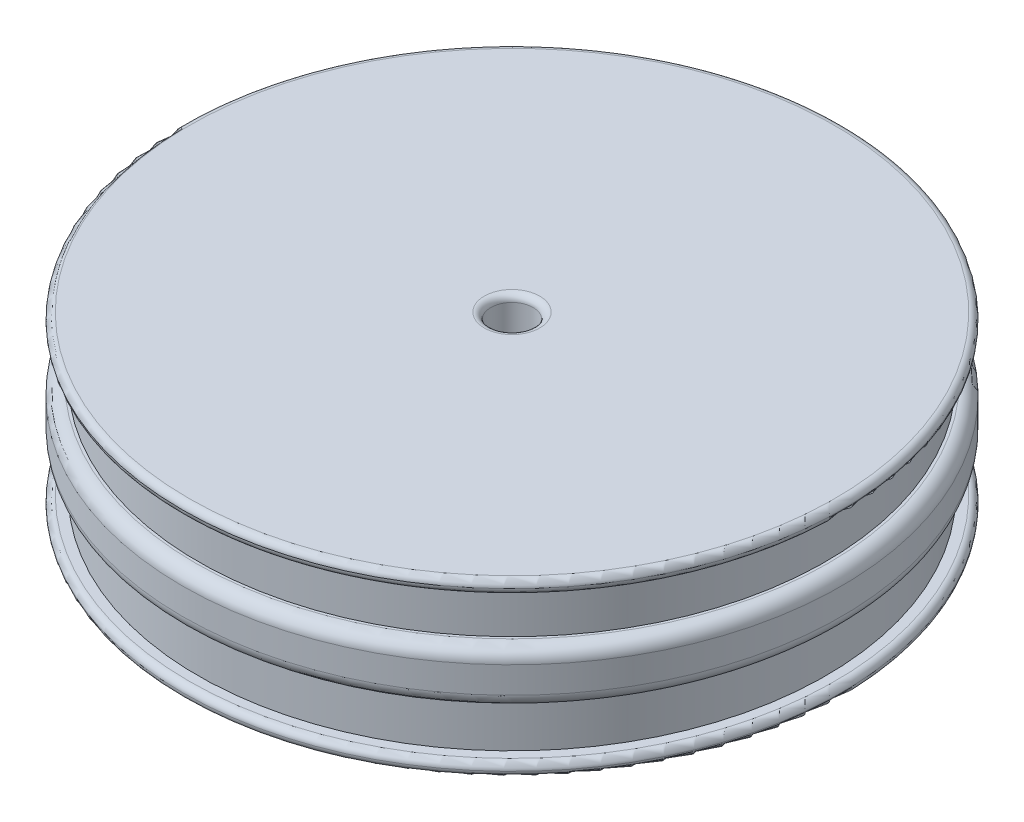
ISO-10303-21;
HEADER;
FILE_DESCRIPTION(('STEP AP214'),'2;1');
FILE_NAME('part.step','',(''),(''),'','','');
FILE_SCHEMA(('AUTOMOTIVE_DESIGN { 1 0 10303 214 1 1 1 1 }'));
ENDSEC;
DATA;
#1=APPLICATION_CONTEXT('core data for automotive mechanical design processes');
#2=APPLICATION_PROTOCOL_DEFINITION('international standard','automotive_design',2000,#1);
#3=PRODUCT_CONTEXT('',#1,'mechanical');
#4=PRODUCT('Part','Part','',(#3));
#5=PRODUCT_RELATED_PRODUCT_CATEGORY('part','',(#4));
#6=PRODUCT_DEFINITION_FORMATION('','',#4);
#7=PRODUCT_DEFINITION_CONTEXT('part definition',#1,'design');
#8=PRODUCT_DEFINITION('design','',#6,#7);
#9=PRODUCT_DEFINITION_SHAPE('','',#8);
#10=(LENGTH_UNIT() NAMED_UNIT(*) SI_UNIT(.MILLI.,.METRE.));
#11=(NAMED_UNIT(*) PLANE_ANGLE_UNIT() SI_UNIT($,.RADIAN.));
#12=(NAMED_UNIT(*) SI_UNIT($,.STERADIAN.) SOLID_ANGLE_UNIT());
#13=UNCERTAINTY_MEASURE_WITH_UNIT(LENGTH_MEASURE(1.E-05),#10,'distance_accuracy_value','');
#14=(GEOMETRIC_REPRESENTATION_CONTEXT(3) GLOBAL_UNCERTAINTY_ASSIGNED_CONTEXT((#13)) GLOBAL_UNIT_ASSIGNED_CONTEXT((#10,
#11,#12)) REPRESENTATION_CONTEXT('',''));
#15=CARTESIAN_POINT('',(0.,0.,0.));
#16=DIRECTION('',(0.,0.,1.));
#17=DIRECTION('',(1.,0.,0.));
#18=AXIS2_PLACEMENT_3D('',#15,#16,#17);
#19=CARTESIAN_POINT('',(0.,13.,0.));
#20=DIRECTION('',(0.,1.,0.));
#21=DIRECTION('',(0.,0.,1.));
#22=AXIS2_PLACEMENT_3D('',#19,#20,#21);
#23=PLANE('',#22);
#24=CARTESIAN_POINT('',(0.,13.,0.));
#25=DIRECTION('',(0.,1.,0.));
#26=DIRECTION('',(0.,0.,1.));
#27=AXIS2_PLACEMENT_3D('',#24,#25,#26);
#28=CIRCLE('',#27,2.1);
#29=CARTESIAN_POINT('',(0.,13.,2.1));
#30=VERTEX_POINT('',#29);
#31=EDGE_CURVE('E10',#30,#30,#28,.F.);
#32=ORIENTED_EDGE('',*,*,#31,.T.);
#33=EDGE_LOOP('',(#32));
#34=FACE_BOUND('',#33,.T.);
#35=CARTESIAN_POINT('',(0.,13.,0.));
#36=DIRECTION('',(0.,1.,0.));
#37=DIRECTION('',(0.,0.,1.));
#38=AXIS2_PLACEMENT_3D('',#35,#36,#37);
#39=CIRCLE('',#38,24.5);
#40=CARTESIAN_POINT('',(0.,13.,24.5));
#41=VERTEX_POINT('',#40);
#42=EDGE_CURVE('E65',#41,#41,#39,.T.);
#43=ORIENTED_EDGE('',*,*,#42,.T.);
#44=EDGE_LOOP('',(#43));
#45=FACE_BOUND('',#44,.T.);
#46=ADVANCED_FACE('F41',(#34,#45),#23,.T.);
#47=CARTESIAN_POINT('',(0.,0.,0.));
#48=DIRECTION('',(0.,1.,0.));
#49=DIRECTION('',(0.,0.,1.));
#50=AXIS2_PLACEMENT_3D('',#47,#48,#49);
#51=PLANE('',#50);
#52=CARTESIAN_POINT('',(0.,0.,0.));
#53=DIRECTION('',(0.,1.,0.));
#54=DIRECTION('',(0.,0.,1.));
#55=AXIS2_PLACEMENT_3D('',#52,#53,#54);
#56=CIRCLE('',#55,2.1);
#57=CARTESIAN_POINT('',(0.,0.,2.1));
#58=VERTEX_POINT('',#57);
#59=EDGE_CURVE('E59',#58,#58,#56,.T.);
#60=ORIENTED_EDGE('',*,*,#59,.T.);
#61=EDGE_LOOP('',(#60));
#62=FACE_BOUND('',#61,.T.);
#63=CARTESIAN_POINT('',(0.,0.,0.));
#64=DIRECTION('',(0.,1.,0.));
#65=DIRECTION('',(0.,0.,1.));
#66=AXIS2_PLACEMENT_3D('',#63,#64,#65);
#67=CIRCLE('',#66,24.5);
#68=CARTESIAN_POINT('',(0.,0.,24.5));
#69=VERTEX_POINT('',#68);
#70=EDGE_CURVE('E69',#69,#69,#67,.F.);
#71=ORIENTED_EDGE('',*,*,#70,.T.);
#72=EDGE_LOOP('',(#71));
#73=FACE_BOUND('',#72,.T.);
#74=ADVANCED_FACE('F140',(#62,#73),#51,.F.);
#75=CARTESIAN_POINT('',(0.,13.,0.));
#76=DIRECTION('',(0.,-1.,0.));
#77=DIRECTION('',(0.,0.,-1.));
#78=AXIS2_PLACEMENT_3D('',#75,#76,#77);
#79=CYLINDRICAL_SURFACE('',#78,1.6);
#80=CARTESIAN_POINT('',(0.,0.500000000000002,0.));
#81=DIRECTION('',(0.,1.,0.));
#82=DIRECTION('',(0.,0.,1.));
#83=AXIS2_PLACEMENT_3D('',#80,#81,#82);
#84=CIRCLE('',#83,1.6);
#85=CARTESIAN_POINT('',(0.,0.5,-1.6));
#86=VERTEX_POINT('',#85);
#87=EDGE_CURVE('E49',#86,#86,#84,.F.);
#88=CARTESIAN_POINT('',(0.,12.5,0.));
#89=DIRECTION('',(0.,1.,0.));
#90=DIRECTION('',(0.,0.,1.));
#91=AXIS2_PLACEMENT_3D('',#88,#89,#90);
#92=CIRCLE('',#91,1.6);
#93=CARTESIAN_POINT('',(0.,12.5,-1.6));
#94=VERTEX_POINT('',#93);
#95=EDGE_CURVE('E54',#94,#94,#92,.T.);
#96=CARTESIAN_POINT('',(0.,0.5,-1.6));
#97=CARTESIAN_POINT('',(0.,0.625000000000001,-1.6));
#98=CARTESIAN_POINT('',(0.,0.750000000000001,-1.6));
#99=CARTESIAN_POINT('',(0.,1.,-1.6));
#100=CARTESIAN_POINT('',(0.,1.125,-1.6));
#101=CARTESIAN_POINT('',(0.,1.375,-1.6));
#102=CARTESIAN_POINT('',(0.,1.5,-1.6));
#103=CARTESIAN_POINT('',(0.,1.75,-1.6));
#104=CARTESIAN_POINT('',(0.,1.875,-1.6));
#105=CARTESIAN_POINT('',(0.,2.125,-1.6));
#106=CARTESIAN_POINT('',(0.,2.25,-1.6));
#107=CARTESIAN_POINT('',(0.,2.5,-1.6));
#108=CARTESIAN_POINT('',(0.,2.625,-1.6));
#109=CARTESIAN_POINT('',(0.,2.875,-1.6));
#110=CARTESIAN_POINT('',(0.,3.,-1.6));
#111=CARTESIAN_POINT('',(0.,3.25,-1.6));
#112=CARTESIAN_POINT('',(0.,3.375,-1.6));
#113=CARTESIAN_POINT('',(0.,3.625,-1.6));
#114=CARTESIAN_POINT('',(0.,3.75,-1.6));
#115=CARTESIAN_POINT('',(0.,4.,-1.6));
#116=CARTESIAN_POINT('',(0.,4.125,-1.6));
#117=CARTESIAN_POINT('',(0.,4.375,-1.6));
#118=CARTESIAN_POINT('',(0.,4.5,-1.6));
#119=CARTESIAN_POINT('',(0.,4.75,-1.6));
#120=CARTESIAN_POINT('',(0.,4.875,-1.6));
#121=CARTESIAN_POINT('',(0.,5.125,-1.6));
#122=CARTESIAN_POINT('',(0.,5.25,-1.6));
#123=CARTESIAN_POINT('',(0.,5.5,-1.6));
#124=CARTESIAN_POINT('',(0.,5.625,-1.6));
#125=CARTESIAN_POINT('',(0.,5.875,-1.6));
#126=CARTESIAN_POINT('',(0.,6.,-1.6));
#127=CARTESIAN_POINT('',(0.,6.25,-1.6));
#128=CARTESIAN_POINT('',(0.,6.375,-1.6));
#129=CARTESIAN_POINT('',(0.,6.625,-1.6));
#130=CARTESIAN_POINT('',(0.,6.75,-1.6));
#131=CARTESIAN_POINT('',(0.,7.,-1.6));
#132=CARTESIAN_POINT('',(0.,7.125,-1.6));
#133=CARTESIAN_POINT('',(0.,7.375,-1.6));
#134=CARTESIAN_POINT('',(0.,7.5,-1.6));
#135=CARTESIAN_POINT('',(0.,7.75,-1.6));
#136=CARTESIAN_POINT('',(0.,7.875,-1.6));
#137=CARTESIAN_POINT('',(0.,8.125,-1.6));
#138=CARTESIAN_POINT('',(0.,8.25,-1.6));
#139=CARTESIAN_POINT('',(0.,8.5,-1.6));
#140=CARTESIAN_POINT('',(0.,8.625,-1.6));
#141=CARTESIAN_POINT('',(0.,8.875,-1.6));
#142=CARTESIAN_POINT('',(0.,9.,-1.6));
#143=CARTESIAN_POINT('',(0.,9.25,-1.6));
#144=CARTESIAN_POINT('',(0.,9.375,-1.6));
#145=CARTESIAN_POINT('',(0.,9.625,-1.6));
#146=CARTESIAN_POINT('',(0.,9.75,-1.6));
#147=CARTESIAN_POINT('',(0.,10.,-1.6));
#148=CARTESIAN_POINT('',(0.,10.125,-1.6));
#149=CARTESIAN_POINT('',(0.,10.375,-1.6));
#150=CARTESIAN_POINT('',(0.,10.5,-1.6));
#151=CARTESIAN_POINT('',(0.,10.75,-1.6));
#152=CARTESIAN_POINT('',(0.,10.875,-1.6));
#153=CARTESIAN_POINT('',(0.,11.125,-1.6));
#154=CARTESIAN_POINT('',(0.,11.25,-1.6));
#155=CARTESIAN_POINT('',(0.,11.5,-1.6));
#156=CARTESIAN_POINT('',(0.,11.625,-1.6));
#157=CARTESIAN_POINT('',(0.,11.875,-1.6));
#158=CARTESIAN_POINT('',(0.,12.,-1.6));
#159=CARTESIAN_POINT('',(0.,12.25,-1.6));
#160=CARTESIAN_POINT('',(0.,12.375,-1.6));
#161=CARTESIAN_POINT('',(0.,12.5,-1.6));
#162=B_SPLINE_CURVE_WITH_KNOTS('',3,(#96,#97,#98,#99,#100,#101,#102,#103,#104,#105,#106,#107,
#108,#109,#110,#111,#112,#113,#114,#115,#116,#117,#118,#119,#120,#121,#122,#123,#124,#125,#126,
#127,#128,#129,#130,#131,#132,#133,#134,#135,#136,#137,#138,#139,#140,#141,#142,#143,#144,#145,
#146,#147,#148,#149,#150,#151,#152,#153,#154,#155,#156,#157,#158,#159,#160,#161),.UNSPECIFIED.,
.F.,.F.,(4,2,2,2,2,2,2,2,2,2,2,2,2,2,2,2,2,2,2,2,2,2,2,2,2,2,2,2,2,2,2,2,4),(0.,0.375,
0.750000000000001,1.125,1.5,1.875,2.25,2.625,3.,3.375,3.75,4.125,4.5,4.875,5.25,5.625,6.,6.375,
6.75,7.125,7.5,7.875,8.25,8.625,9.,9.375,9.75,10.125,10.5,10.875,11.25,11.625,12.),.UNSPECIFIED.);
#163=EDGE_CURVE('BSEAM145',#86,#94,#162,.T.);
#164=ORIENTED_EDGE('',*,*,#87,.T.);
#165=ORIENTED_EDGE('',*,*,#95,.T.);
#166=ORIENTED_EDGE('',*,*,#163,.T.);
#167=ORIENTED_EDGE('',*,*,#163,.F.);
#168=EDGE_LOOP('',(#164,#166,#165,#167));
#169=FACE_BOUND('',#168,.T.);
#170=ADVANCED_FACE('F145',(#169),#79,.F.);
#171=CARTESIAN_POINT('',(0.,1.,25.));
#172=DIRECTION('',(0.,1.,0.));
#173=DIRECTION('',(0.,0.,1.));
#174=AXIS2_PLACEMENT_3D('',#171,#172,#173);
#175=PLANE('',#174);
#176=CARTESIAN_POINT('',(0.,1.,0.));
#177=DIRECTION('',(0.,1.,0.));
#178=DIRECTION('',(0.,0.,1.));
#179=AXIS2_PLACEMENT_3D('',#176,#177,#178);
#180=CIRCLE('',#179,24.5);
#181=CARTESIAN_POINT('',(0.,1.,24.5));
#182=VERTEX_POINT('',#181);
#183=EDGE_CURVE('E73',#182,#182,#180,.T.);
#184=ORIENTED_EDGE('',*,*,#183,.T.);
#185=EDGE_LOOP('',(#184));
#186=FACE_BOUND('',#185,.T.);
#187=CARTESIAN_POINT('',(0.,1.,0.));
#188=DIRECTION('',(0.,-1.,0.));
#189=DIRECTION('',(0.,0.,-1.));
#190=AXIS2_PLACEMENT_3D('',#187,#188,#189);
#191=CIRCLE('',#190,23.8);
#192=CARTESIAN_POINT('',(0.,1.,-23.8));
#193=VERTEX_POINT('',#192);
#194=EDGE_CURVE('E106',#193,#193,#191,.T.);
#195=ORIENTED_EDGE('',*,*,#194,.T.);
#196=EDGE_LOOP('',(#195));
#197=FACE_BOUND('',#196,.T.);
#198=ADVANCED_FACE('F194',(#186,#197),#175,.T.);
#199=CARTESIAN_POINT('',(0.,-0.543449180327872,0.));
#200=DIRECTION('',(0.,-1.,0.));
#201=DIRECTION('',(0.,0.,-1.));
#202=AXIS2_PLACEMENT_3D('',#199,#200,#201);
#203=CYLINDRICAL_SURFACE('',#202,23.8);
#204=CARTESIAN_POINT('',(0.,4.5,0.));
#205=DIRECTION('',(0.,-1.,0.));
#206=DIRECTION('',(0.,0.,-1.));
#207=AXIS2_PLACEMENT_3D('',#204,#205,#206);
#208=CIRCLE('',#207,23.8);
#209=CARTESIAN_POINT('',(0.,4.5,-23.8));
#210=VERTEX_POINT('',#209);
#211=EDGE_CURVE('E111',#210,#210,#208,.T.);
#212=ORIENTED_EDGE('',*,*,#211,.T.);
#213=EDGE_LOOP('',(#212));
#214=FACE_BOUND('',#213,.T.);
#215=ORIENTED_EDGE('',*,*,#194,.F.);
#216=EDGE_LOOP('',(#215));
#217=FACE_BOUND('',#216,.T.);
#218=ADVANCED_FACE('F198',(#214,#217),#203,.T.);
#219=CARTESIAN_POINT('',(0.,4.5,25.));
#220=DIRECTION('',(0.,-1.,0.));
#221=DIRECTION('',(0.,0.,-1.));
#222=AXIS2_PLACEMENT_3D('',#219,#220,#221);
#223=PLANE('',#222);
#224=CARTESIAN_POINT('',(0.,4.5,0.));
#225=DIRECTION('',(0.,-1.,0.));
#226=DIRECTION('',(0.,0.,-1.));
#227=AXIS2_PLACEMENT_3D('',#224,#225,#226);
#228=CIRCLE('',#227,24.);
#229=CARTESIAN_POINT('',(0.,4.5,-24.));
#230=VERTEX_POINT('',#229);
#231=EDGE_CURVE('E101',#230,#230,#228,.T.);
#232=ORIENTED_EDGE('',*,*,#231,.T.);
#233=EDGE_LOOP('',(#232));
#234=FACE_BOUND('',#233,.T.);
#235=ORIENTED_EDGE('',*,*,#211,.F.);
#236=EDGE_LOOP('',(#235));
#237=FACE_BOUND('',#236,.T.);
#238=ADVANCED_FACE('F203',(#234,#237),#223,.T.);
#239=CARTESIAN_POINT('',(0.,8.5,25.));
#240=DIRECTION('',(0.,1.,0.));
#241=DIRECTION('',(0.,0.,1.));
#242=AXIS2_PLACEMENT_3D('',#239,#240,#241);
#243=PLANE('',#242);
#244=CARTESIAN_POINT('',(0.,8.5,0.));
#245=DIRECTION('',(0.,1.,0.));
#246=DIRECTION('',(0.,0.,1.));
#247=AXIS2_PLACEMENT_3D('',#244,#245,#246);
#248=CIRCLE('',#247,24.);
#249=CARTESIAN_POINT('',(0.,8.5,24.));
#250=VERTEX_POINT('',#249);
#251=EDGE_CURVE('E89',#250,#250,#248,.T.);
#252=ORIENTED_EDGE('',*,*,#251,.T.);
#253=EDGE_LOOP('',(#252));
#254=FACE_BOUND('',#253,.T.);
#255=CARTESIAN_POINT('',(0.,8.5,0.));
#256=DIRECTION('',(0.,-1.,0.));
#257=DIRECTION('',(0.,0.,-1.));
#258=AXIS2_PLACEMENT_3D('',#255,#256,#257);
#259=CIRCLE('',#258,23.8);
#260=CARTESIAN_POINT('',(0.,8.5,-23.8));
#261=VERTEX_POINT('',#260);
#262=EDGE_CURVE('E105',#261,#261,#259,.T.);
#263=ORIENTED_EDGE('',*,*,#262,.T.);
#264=EDGE_LOOP('',(#263));
#265=FACE_BOUND('',#264,.T.);
#266=ADVANCED_FACE('F137',(#254,#265),#243,.T.);
#267=CARTESIAN_POINT('',(0.,-0.543449180327872,0.));
#268=DIRECTION('',(0.,-1.,0.));
#269=DIRECTION('',(0.,0.,-1.));
#270=AXIS2_PLACEMENT_3D('',#267,#268,#269);
#271=CYLINDRICAL_SURFACE('',#270,23.8);
#272=CARTESIAN_POINT('',(0.,12.,0.));
#273=DIRECTION('',(0.,-1.,0.));
#274=DIRECTION('',(0.,0.,-1.));
#275=AXIS2_PLACEMENT_3D('',#272,#273,#274);
#276=CIRCLE('',#275,23.8);
#277=CARTESIAN_POINT('',(0.,12.,-23.8));
#278=VERTEX_POINT('',#277);
#279=EDGE_CURVE('E110',#278,#278,#276,.T.);
#280=ORIENTED_EDGE('',*,*,#279,.T.);
#281=EDGE_LOOP('',(#280));
#282=FACE_BOUND('',#281,.T.);
#283=ORIENTED_EDGE('',*,*,#262,.F.);
#284=EDGE_LOOP('',(#283));
#285=FACE_BOUND('',#284,.T.);
#286=ADVANCED_FACE('F122',(#282,#285),#271,.T.);
#287=CARTESIAN_POINT('',(0.,12.,25.));
#288=DIRECTION('',(0.,-1.,0.));
#289=DIRECTION('',(0.,0.,-1.));
#290=AXIS2_PLACEMENT_3D('',#287,#288,#289);
#291=PLANE('',#290);
#292=CARTESIAN_POINT('',(0.,12.,0.));
#293=DIRECTION('',(0.,-1.,0.));
#294=DIRECTION('',(0.,0.,-1.));
#295=AXIS2_PLACEMENT_3D('',#292,#293,#294);
#296=CIRCLE('',#295,24.5);
#297=CARTESIAN_POINT('',(0.,12.,-24.5));
#298=VERTEX_POINT('',#297);
#299=EDGE_CURVE('E85',#298,#298,#296,.T.);
#300=ORIENTED_EDGE('',*,*,#299,.T.);
#301=EDGE_LOOP('',(#300));
#302=FACE_BOUND('',#301,.T.);
#303=ORIENTED_EDGE('',*,*,#279,.F.);
#304=EDGE_LOOP('',(#303));
#305=FACE_BOUND('',#304,.T.);
#306=ADVANCED_FACE('F125',(#302,#305),#291,.T.);
#307=CARTESIAN_POINT('',(0.,13.,0.));
#308=DIRECTION('',(0.,-1.,0.));
#309=DIRECTION('',(0.,0.,-1.));
#310=AXIS2_PLACEMENT_3D('',#307,#308,#309);
#311=CYLINDRICAL_SURFACE('',#310,25.);
#312=CARTESIAN_POINT('',(0.,5.5,0.));
#313=DIRECTION('',(0.,-1.,0.));
#314=DIRECTION('',(0.,0.,-1.));
#315=AXIS2_PLACEMENT_3D('',#312,#313,#314);
#316=CIRCLE('',#315,25.);
#317=CARTESIAN_POINT('',(0.,5.5,-25.));
#318=VERTEX_POINT('',#317);
#319=EDGE_CURVE('E93',#318,#318,#316,.F.);
#320=CARTESIAN_POINT('',(0.,7.5,0.));
#321=DIRECTION('',(0.,1.,0.));
#322=DIRECTION('',(0.,0.,1.));
#323=AXIS2_PLACEMENT_3D('',#320,#321,#322);
#324=CIRCLE('',#323,25.);
#325=CARTESIAN_POINT('',(0.,7.5,-25.));
#326=VERTEX_POINT('',#325);
#327=EDGE_CURVE('E97',#326,#326,#324,.F.);
#328=CARTESIAN_POINT('',(0.,5.5,-25.));
#329=CARTESIAN_POINT('',(0.,5.52083333333333,-25.));
#330=CARTESIAN_POINT('',(0.,5.54166666666667,-25.));
#331=CARTESIAN_POINT('',(0.,5.58333333333333,-25.));
#332=CARTESIAN_POINT('',(0.,5.60416666666667,-25.));
#333=CARTESIAN_POINT('',(0.,5.64583333333333,-25.));
#334=CARTESIAN_POINT('',(0.,5.66666666666667,-25.));
#335=CARTESIAN_POINT('',(0.,5.70833333333333,-25.));
#336=CARTESIAN_POINT('',(0.,5.72916666666667,-25.));
#337=CARTESIAN_POINT('',(0.,5.77083333333333,-25.));
#338=CARTESIAN_POINT('',(0.,5.79166666666667,-25.));
#339=CARTESIAN_POINT('',(0.,5.83333333333333,-25.));
#340=CARTESIAN_POINT('',(0.,5.85416666666667,-25.));
#341=CARTESIAN_POINT('',(0.,5.89583333333333,-25.));
#342=CARTESIAN_POINT('',(0.,5.91666666666667,-25.));
#343=CARTESIAN_POINT('',(0.,5.95833333333333,-25.));
#344=CARTESIAN_POINT('',(0.,5.97916666666667,-25.));
#345=CARTESIAN_POINT('',(0.,6.02083333333333,-25.));
#346=CARTESIAN_POINT('',(0.,6.04166666666667,-25.));
#347=CARTESIAN_POINT('',(0.,6.08333333333333,-25.));
#348=CARTESIAN_POINT('',(0.,6.10416666666667,-25.));
#349=CARTESIAN_POINT('',(0.,6.14583333333333,-25.));
#350=CARTESIAN_POINT('',(0.,6.16666666666667,-25.));
#351=CARTESIAN_POINT('',(0.,6.20833333333333,-25.));
#352=CARTESIAN_POINT('',(0.,6.22916666666667,-25.));
#353=CARTESIAN_POINT('',(0.,6.27083333333333,-25.));
#354=CARTESIAN_POINT('',(0.,6.29166666666667,-25.));
#355=CARTESIAN_POINT('',(0.,6.33333333333333,-25.));
#356=CARTESIAN_POINT('',(0.,6.35416666666667,-25.));
#357=CARTESIAN_POINT('',(0.,6.39583333333333,-25.));
#358=CARTESIAN_POINT('',(0.,6.41666666666667,-25.));
#359=CARTESIAN_POINT('',(0.,6.45833333333333,-25.));
#360=CARTESIAN_POINT('',(0.,6.47916666666667,-25.));
#361=CARTESIAN_POINT('',(0.,6.52083333333333,-25.));
#362=CARTESIAN_POINT('',(0.,6.54166666666667,-25.));
#363=CARTESIAN_POINT('',(0.,6.58333333333333,-25.));
#364=CARTESIAN_POINT('',(0.,6.60416666666667,-25.));
#365=CARTESIAN_POINT('',(0.,6.64583333333333,-25.));
#366=CARTESIAN_POINT('',(0.,6.66666666666667,-25.));
#367=CARTESIAN_POINT('',(0.,6.70833333333333,-25.));
#368=CARTESIAN_POINT('',(0.,6.72916666666667,-25.));
#369=CARTESIAN_POINT('',(0.,6.77083333333333,-25.));
#370=CARTESIAN_POINT('',(0.,6.79166666666667,-25.));
#371=CARTESIAN_POINT('',(0.,6.83333333333333,-25.));
#372=CARTESIAN_POINT('',(0.,6.85416666666667,-25.));
#373=CARTESIAN_POINT('',(0.,6.89583333333333,-25.));
#374=CARTESIAN_POINT('',(0.,6.91666666666667,-25.));
#375=CARTESIAN_POINT('',(0.,6.95833333333333,-25.));
#376=CARTESIAN_POINT('',(0.,6.97916666666667,-25.));
#377=CARTESIAN_POINT('',(0.,7.02083333333333,-25.));
#378=CARTESIAN_POINT('',(0.,7.04166666666667,-25.));
#379=CARTESIAN_POINT('',(0.,7.08333333333333,-25.));
#380=CARTESIAN_POINT('',(0.,7.10416666666667,-25.));
#381=CARTESIAN_POINT('',(0.,7.14583333333333,-25.));
#382=CARTESIAN_POINT('',(0.,7.16666666666667,-25.));
#383=CARTESIAN_POINT('',(0.,7.20833333333333,-25.));
#384=CARTESIAN_POINT('',(0.,7.22916666666667,-25.));
#385=CARTESIAN_POINT('',(0.,7.27083333333333,-25.));
#386=CARTESIAN_POINT('',(0.,7.29166666666667,-25.));
#387=CARTESIAN_POINT('',(0.,7.33333333333333,-25.));
#388=CARTESIAN_POINT('',(0.,7.35416666666667,-25.));
#389=CARTESIAN_POINT('',(0.,7.39583333333333,-25.));
#390=CARTESIAN_POINT('',(0.,7.41666666666667,-25.));
#391=CARTESIAN_POINT('',(0.,7.45833333333333,-25.));
#392=CARTESIAN_POINT('',(0.,7.47916666666667,-25.));
#393=CARTESIAN_POINT('',(0.,7.5,-25.));
#394=B_SPLINE_CURVE_WITH_KNOTS('',3,(#328,#329,#330,#331,#332,#333,#334,#335,#336,#337,#338,
#339,#340,#341,#342,#343,#344,#345,#346,#347,#348,#349,#350,#351,#352,#353,#354,#355,#356,#357,
#358,#359,#360,#361,#362,#363,#364,#365,#366,#367,#368,#369,#370,#371,#372,#373,#374,#375,#376,
#377,#378,#379,#380,#381,#382,#383,#384,#385,#386,#387,#388,#389,#390,#391,#392,#393),
.UNSPECIFIED.,.F.,.F.,(4,2,2,2,2,2,2,2,2,2,2,2,2,2,2,2,2,2,2,2,2,2,2,2,2,2,2,2,2,2,2,2,4),(0.,
0.0625000000000001,0.125,0.1875,0.25,0.3125,0.375,0.4375,0.5,0.5625,0.625,0.6875,0.75,0.8125,
0.875,0.9375,1.,1.0625,1.125,1.1875,1.25,1.3125,1.375,1.4375,1.5,1.5625,1.625,1.6875,1.75,
1.8125,1.875,1.9375,2.),.UNSPECIFIED.);
#395=EDGE_CURVE('BSEAM127',#318,#326,#394,.T.);
#396=ORIENTED_EDGE('',*,*,#319,.T.);
#397=ORIENTED_EDGE('',*,*,#327,.T.);
#398=ORIENTED_EDGE('',*,*,#395,.T.);
#399=ORIENTED_EDGE('',*,*,#395,.F.);
#400=EDGE_LOOP('',(#396,#398,#397,#399));
#401=FACE_BOUND('',#400,.T.);
#402=ADVANCED_FACE('F127',(#401),#311,.T.);
#403=CARTESIAN_POINT('',(0.,5.5,0.));
#404=DIRECTION('',(0.,-1.,0.));
#405=DIRECTION('',(0.,0.,-1.));
#406=AXIS2_PLACEMENT_3D('',#403,#404,#405);
#407=TOROIDAL_SURFACE('',#406,24.,1.);
#408=ORIENTED_EDGE('',*,*,#319,.F.);
#409=EDGE_LOOP('',(#408));
#410=FACE_BOUND('',#409,.T.);
#411=ORIENTED_EDGE('',*,*,#231,.F.);
#412=EDGE_LOOP('',(#411));
#413=FACE_BOUND('',#412,.T.);
#414=ADVANCED_FACE('F134',(#410,#413),#407,.T.);
#415=CARTESIAN_POINT('',(0.,7.5,0.));
#416=DIRECTION('',(0.,1.,0.));
#417=DIRECTION('',(0.,0.,1.));
#418=AXIS2_PLACEMENT_3D('',#415,#416,#417);
#419=TOROIDAL_SURFACE('',#418,24.,1.);
#420=ORIENTED_EDGE('',*,*,#251,.F.);
#421=EDGE_LOOP('',(#420));
#422=FACE_BOUND('',#421,.T.);
#423=ORIENTED_EDGE('',*,*,#327,.F.);
#424=EDGE_LOOP('',(#423));
#425=FACE_BOUND('',#424,.T.);
#426=ADVANCED_FACE('F154',(#422,#425),#419,.T.);
#427=CARTESIAN_POINT('',(0.,12.5,0.));
#428=DIRECTION('',(0.,-1.,0.));
#429=DIRECTION('',(0.,0.,-1.));
#430=AXIS2_PLACEMENT_3D('',#427,#428,#429);
#431=TOROIDAL_SURFACE('',#430,24.5,0.5);
#432=CARTESIAN_POINT('',(0.,12.5,0.));
#433=DIRECTION('',(0.,-1.,0.));
#434=DIRECTION('',(0.,0.,-1.));
#435=AXIS2_PLACEMENT_3D('',#432,#433,#434);
#436=CIRCLE('',#435,25.);
#437=CARTESIAN_POINT('',(0.,12.5,-25.));
#438=VERTEX_POINT('',#437);
#439=EDGE_CURVE('E81',#438,#438,#436,.F.);
#440=ORIENTED_EDGE('',*,*,#439,.F.);
#441=EDGE_LOOP('',(#440));
#442=FACE_BOUND('',#441,.T.);
#443=ORIENTED_EDGE('',*,*,#299,.F.);
#444=EDGE_LOOP('',(#443));
#445=FACE_BOUND('',#444,.T.);
#446=ADVANCED_FACE('F158',(#442,#445),#431,.T.);
#447=CARTESIAN_POINT('',(0.,0.5,0.));
#448=DIRECTION('',(0.,1.,0.));
#449=DIRECTION('',(0.,0.,1.));
#450=AXIS2_PLACEMENT_3D('',#447,#448,#449);
#451=TOROIDAL_SURFACE('',#450,24.5,0.5);
#452=ORIENTED_EDGE('',*,*,#183,.F.);
#453=EDGE_LOOP('',(#452));
#454=FACE_BOUND('',#453,.T.);
#455=CARTESIAN_POINT('',(0.,0.5,0.));
#456=DIRECTION('',(0.,1.,0.));
#457=DIRECTION('',(0.,0.,1.));
#458=AXIS2_PLACEMENT_3D('',#455,#456,#457);
#459=CIRCLE('',#458,25.);
#460=CARTESIAN_POINT('',(0.,0.5,25.));
#461=VERTEX_POINT('',#460);
#462=EDGE_CURVE('E77',#461,#461,#459,.F.);
#463=ORIENTED_EDGE('',*,*,#462,.F.);
#464=EDGE_LOOP('',(#463));
#465=FACE_BOUND('',#464,.T.);
#466=ADVANCED_FACE('F162',(#454,#465),#451,.T.);
#467=CARTESIAN_POINT('',(0.,0.5,0.));
#468=DIRECTION('',(0.,1.,0.));
#469=DIRECTION('',(0.,0.,1.));
#470=AXIS2_PLACEMENT_3D('',#467,#468,#469);
#471=TOROIDAL_SURFACE('',#470,24.5,0.5);
#472=ORIENTED_EDGE('',*,*,#70,.F.);
#473=EDGE_LOOP('',(#472));
#474=FACE_BOUND('',#473,.T.);
#475=ORIENTED_EDGE('',*,*,#462,.T.);
#476=EDGE_LOOP('',(#475));
#477=FACE_BOUND('',#476,.T.);
#478=ADVANCED_FACE('F166',(#474,#477),#471,.T.);
#479=CARTESIAN_POINT('',(0.,12.5,0.));
#480=DIRECTION('',(0.,1.,0.));
#481=DIRECTION('',(0.,0.,1.));
#482=AXIS2_PLACEMENT_3D('',#479,#480,#481);
#483=TOROIDAL_SURFACE('',#482,24.5,0.5);
#484=ORIENTED_EDGE('',*,*,#439,.T.);
#485=EDGE_LOOP('',(#484));
#486=FACE_BOUND('',#485,.T.);
#487=ORIENTED_EDGE('',*,*,#42,.F.);
#488=EDGE_LOOP('',(#487));
#489=FACE_BOUND('',#488,.T.);
#490=ADVANCED_FACE('F170',(#486,#489),#483,.T.);
#491=CARTESIAN_POINT('',(0.,0.5,0.));
#492=DIRECTION('',(0.,1.,0.));
#493=DIRECTION('',(0.,0.,1.));
#494=AXIS2_PLACEMENT_3D('',#491,#492,#493);
#495=TOROIDAL_SURFACE('',#494,2.1,0.5);
#496=ORIENTED_EDGE('',*,*,#87,.F.);
#497=EDGE_LOOP('',(#496));
#498=FACE_BOUND('',#497,.T.);
#499=ORIENTED_EDGE('',*,*,#59,.F.);
#500=EDGE_LOOP('',(#499));
#501=FACE_BOUND('',#500,.T.);
#502=ADVANCED_FACE('F173',(#498,#501),#495,.T.);
#503=CARTESIAN_POINT('',(0.,12.5,0.));
#504=DIRECTION('',(0.,1.,0.));
#505=DIRECTION('',(0.,0.,1.));
#506=AXIS2_PLACEMENT_3D('',#503,#504,#505);
#507=TOROIDAL_SURFACE('',#506,2.1,0.5);
#508=ORIENTED_EDGE('',*,*,#31,.F.);
#509=EDGE_LOOP('',(#508));
#510=FACE_BOUND('',#509,.T.);
#511=ORIENTED_EDGE('',*,*,#95,.F.);
#512=EDGE_LOOP('',(#511));
#513=FACE_BOUND('',#512,.T.);
#514=ADVANCED_FACE('F43',(#510,#513),#507,.T.);
#515=CLOSED_SHELL('',(#46,#74,#170,#198,#218,#238,#266,#286,#306,#402,#414,#426,#446,#466,#478,
#490,#502,#514));
#516=MANIFOLD_SOLID_BREP('B2',#515);
#517=ADVANCED_BREP_SHAPE_REPRESENTATION('',(#18,#516),#14);
#518=SHAPE_DEFINITION_REPRESENTATION(#9,#517);
ENDSEC;
END-ISO-10303-21;
